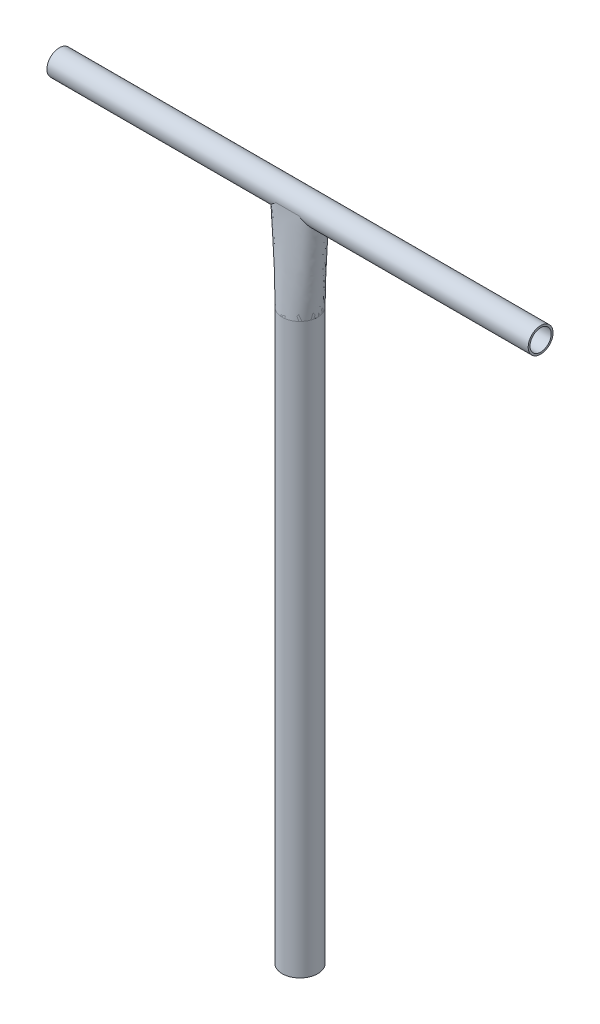
ISO-10303-21;
HEADER;
FILE_DESCRIPTION(('STEP AP214'),'2;1');
FILE_NAME('part.step','',(''),(''),'','','');
FILE_SCHEMA(('AUTOMOTIVE_DESIGN { 1 0 10303 214 1 1 1 1 }'));
ENDSEC;
DATA;
#1=APPLICATION_CONTEXT('core data for automotive mechanical design processes');
#2=APPLICATION_PROTOCOL_DEFINITION('international standard','automotive_design',2000,#1);
#3=PRODUCT_CONTEXT('',#1,'mechanical');
#4=PRODUCT('Part','Part','',(#3));
#5=PRODUCT_RELATED_PRODUCT_CATEGORY('part','',(#4));
#6=PRODUCT_DEFINITION_FORMATION('','',#4);
#7=PRODUCT_DEFINITION_CONTEXT('part definition',#1,'design');
#8=PRODUCT_DEFINITION('design','',#6,#7);
#9=PRODUCT_DEFINITION_SHAPE('','',#8);
#10=(LENGTH_UNIT() NAMED_UNIT(*) SI_UNIT(.MILLI.,.METRE.));
#11=(NAMED_UNIT(*) PLANE_ANGLE_UNIT() SI_UNIT($,.RADIAN.));
#12=(NAMED_UNIT(*) SI_UNIT($,.STERADIAN.) SOLID_ANGLE_UNIT());
#13=UNCERTAINTY_MEASURE_WITH_UNIT(LENGTH_MEASURE(1.E-05),#10,'distance_accuracy_value','');
#14=(GEOMETRIC_REPRESENTATION_CONTEXT(3) GLOBAL_UNCERTAINTY_ASSIGNED_CONTEXT((#13)) GLOBAL_UNIT_ASSIGNED_CONTEXT((#10,
#11,#12)) REPRESENTATION_CONTEXT('',''));
#15=CARTESIAN_POINT('',(0.,0.,0.));
#16=DIRECTION('',(0.,0.,1.));
#17=DIRECTION('',(1.,0.,0.));
#18=AXIS2_PLACEMENT_3D('',#15,#16,#17);
#19=CARTESIAN_POINT('',(215.,590.,0.));
#20=DIRECTION('',(-1.,0.,0.));
#21=DIRECTION('',(0.,0.,1.));
#22=AXIS2_PLACEMENT_3D('',#19,#20,#21);
#23=CYLINDRICAL_SURFACE('',#22,9.46150000000001);
#24=CARTESIAN_POINT('',(215.,590.,0.));
#25=DIRECTION('',(1.,0.,0.));
#26=DIRECTION('',(0.,0.,-1.));
#27=AXIS2_PLACEMENT_3D('',#24,#25,#26);
#28=CIRCLE('',#27,9.46150000000001);
#29=CARTESIAN_POINT('',(215.,590.,-9.46150000000001));
#30=VERTEX_POINT('',#29);
#31=EDGE_CURVE('E229',#30,#30,#28,.T.);
#32=ORIENTED_EDGE('',*,*,#31,.T.);
#33=EDGE_LOOP('',(#32));
#34=FACE_BOUND('',#33,.T.);
#35=CARTESIAN_POINT('',(-215.,590.,0.));
#36=DIRECTION('',(1.,0.,0.));
#37=DIRECTION('',(0.,0.,-1.));
#38=AXIS2_PLACEMENT_3D('',#35,#36,#37);
#39=CIRCLE('',#38,9.46150000000001);
#40=CARTESIAN_POINT('',(-215.,590.,-9.46150000000001));
#41=VERTEX_POINT('',#40);
#42=EDGE_CURVE('E235',#41,#41,#39,.T.);
#43=ORIENTED_EDGE('',*,*,#42,.F.);
#44=EDGE_LOOP('',(#43));
#45=FACE_BOUND('',#44,.T.);
#46=ADVANCED_FACE('F222',(#34,#45),#23,.F.);
#47=CARTESIAN_POINT('',(215.,590.,0.));
#48=DIRECTION('',(-1.,0.,0.));
#49=DIRECTION('',(0.,0.,1.));
#50=AXIS2_PLACEMENT_3D('',#47,#48,#49);
#51=CYLINDRICAL_SURFACE('',#50,11.1125);
#52=CARTESIAN_POINT('',(215.,590.,0.));
#53=DIRECTION('',(1.,0.,0.));
#54=DIRECTION('',(0.,0.,-1.));
#55=AXIS2_PLACEMENT_3D('',#52,#53,#54);
#56=CIRCLE('',#55,11.1125);
#57=CARTESIAN_POINT('',(215.,590.,-11.1125));
#58=VERTEX_POINT('',#57);
#59=EDGE_CURVE('E12',#58,#58,#56,.T.);
#60=ORIENTED_EDGE('',*,*,#59,.F.);
#61=EDGE_LOOP('',(#60));
#62=FACE_BOUND('',#61,.T.);
#63=CARTESIAN_POINT('',(-215.,590.,0.));
#64=DIRECTION('',(1.,0.,0.));
#65=DIRECTION('',(0.,0.,-1.));
#66=AXIS2_PLACEMENT_3D('',#63,#64,#65);
#67=CIRCLE('',#66,11.1125);
#68=CARTESIAN_POINT('',(-215.,590.,-11.1125));
#69=VERTEX_POINT('',#68);
#70=EDGE_CURVE('E225',#69,#69,#67,.T.);
#71=ORIENTED_EDGE('',*,*,#70,.T.);
#72=EDGE_LOOP('',(#71));
#73=FACE_BOUND('',#72,.T.);
#74=ADVANCED_FACE('F242',(#62,#73),#51,.T.);
#75=CARTESIAN_POINT('',(215.,590.,0.));
#76=DIRECTION('',(1.,0.,0.));
#77=DIRECTION('',(0.,0.,-1.));
#78=AXIS2_PLACEMENT_3D('',#75,#76,#77);
#79=PLANE('',#78);
#80=ORIENTED_EDGE('',*,*,#31,.F.);
#81=EDGE_LOOP('',(#80));
#82=FACE_BOUND('',#81,.T.);
#83=ORIENTED_EDGE('',*,*,#59,.T.);
#84=EDGE_LOOP('',(#83));
#85=FACE_BOUND('',#84,.T.);
#86=ADVANCED_FACE('F246',(#82,#85),#79,.T.);
#87=CARTESIAN_POINT('',(-215.,590.,0.));
#88=DIRECTION('',(1.,0.,0.));
#89=DIRECTION('',(0.,0.,-1.));
#90=AXIS2_PLACEMENT_3D('',#87,#88,#89);
#91=PLANE('',#90);
#92=ORIENTED_EDGE('',*,*,#42,.T.);
#93=EDGE_LOOP('',(#92));
#94=FACE_BOUND('',#93,.T.);
#95=ORIENTED_EDGE('',*,*,#70,.F.);
#96=EDGE_LOOP('',(#95));
#97=FACE_BOUND('',#96,.T.);
#98=ADVANCED_FACE('F244',(#94,#97),#91,.F.);
#99=CLOSED_SHELL('',(#46,#74,#86,#98));
#100=MANIFOLD_SOLID_BREP('B2',#99);
#101=CARTESIAN_POINT('',(-11.,590.,0.));
#102=DIRECTION('',(0.,1.,0.));
#103=DIRECTION('',(0.,0.,1.));
#104=AXIS2_PLACEMENT_3D('',#101,#102,#103);
#105=PLANE('',#104);
#106=CARTESIAN_POINT('',(-11.,590.,0.));
#107=DIRECTION('',(0.,1.,0.));
#108=DIRECTION('',(0.,0.,1.));
#109=AXIS2_PLACEMENT_3D('',#106,#107,#108);
#110=CIRCLE('',#109,9.34900000000001);
#111=CARTESIAN_POINT('',(-11.,590.,-9.34900000000001));
#112=VERTEX_POINT('',#111);
#113=CARTESIAN_POINT('',(-10.9999999999997,590.,9.34900000000001));
#114=VERTEX_POINT('',#113);
#115=EDGE_CURVE('E358',#112,#114,#110,.T.);
#116=ORIENTED_EDGE('',*,*,#115,.F.);
#117=DIRECTION('',(-1.,0.,0.));
#118=VECTOR('',#117,1.);
#119=CARTESIAN_POINT('',(11.,590.,-9.34900000000001));
#120=LINE('',#119,#118);
#121=CARTESIAN_POINT('',(11.,590.,-9.34900000000001));
#122=VERTEX_POINT('',#121);
#123=EDGE_CURVE('E353',#122,#112,#120,.T.);
#124=ORIENTED_EDGE('',*,*,#123,.F.);
#125=CARTESIAN_POINT('',(11.,590.,0.));
#126=DIRECTION('',(0.,1.,0.));
#127=DIRECTION('',(0.,0.,1.));
#128=AXIS2_PLACEMENT_3D('',#125,#126,#127);
#129=CIRCLE('',#128,9.34900000000001);
#130=CARTESIAN_POINT('',(11.0000000000155,590.,9.34899999999972));
#131=VERTEX_POINT('',#130);
#132=EDGE_CURVE('E328',#131,#122,#129,.T.);
#133=ORIENTED_EDGE('',*,*,#132,.F.);
#134=DIRECTION('',(1.,0.,0.));
#135=VECTOR('',#134,1.);
#136=CARTESIAN_POINT('',(-11.,590.,9.34900000000001));
#137=LINE('',#136,#135);
#138=EDGE_CURVE('E314',#114,#131,#137,.T.);
#139=ORIENTED_EDGE('',*,*,#138,.F.);
#140=EDGE_LOOP('',(#116,#124,#133,#139));
#141=FACE_BOUND('',#140,.T.);
#142=CARTESIAN_POINT('',(-11.,590.,0.));
#143=DIRECTION('',(0.,1.,0.));
#144=DIRECTION('',(0.,0.,1.));
#145=AXIS2_PLACEMENT_3D('',#142,#143,#144);
#146=CIRCLE('',#145,11.);
#147=CARTESIAN_POINT('',(-11.,590.,-11.));
#148=VERTEX_POINT('',#147);
#149=CARTESIAN_POINT('',(-10.9999999995275,590.,11.));
#150=VERTEX_POINT('',#149);
#151=EDGE_CURVE('E436',#148,#150,#146,.T.);
#152=ORIENTED_EDGE('',*,*,#151,.T.);
#153=DIRECTION('',(1.,0.,0.));
#154=VECTOR('',#153,1.);
#155=CARTESIAN_POINT('',(-11.,590.,11.));
#156=LINE('',#155,#154);
#157=CARTESIAN_POINT('',(11.000000000005,590.,11.));
#158=VERTEX_POINT('',#157);
#159=EDGE_CURVE('E337',#150,#158,#156,.T.);
#160=ORIENTED_EDGE('',*,*,#159,.T.);
#161=CARTESIAN_POINT('',(11.,590.,0.));
#162=DIRECTION('',(0.,1.,0.));
#163=DIRECTION('',(0.,0.,1.));
#164=AXIS2_PLACEMENT_3D('',#161,#162,#163);
#165=CIRCLE('',#164,11.);
#166=CARTESIAN_POINT('',(11.,590.,-11.));
#167=VERTEX_POINT('',#166);
#168=EDGE_CURVE('E320',#158,#167,#165,.T.);
#169=ORIENTED_EDGE('',*,*,#168,.T.);
#170=DIRECTION('',(-1.,0.,0.));
#171=VECTOR('',#170,1.);
#172=CARTESIAN_POINT('',(-11.,590.,-11.));
#173=LINE('',#172,#171);
#174=EDGE_CURVE('E220',#167,#148,#173,.T.);
#175=ORIENTED_EDGE('',*,*,#174,.T.);
#176=EDGE_LOOP('',(#152,#160,#169,#175));
#177=FACE_BOUND('',#176,.T.);
#178=ADVANCED_FACE('F307',(#141,#177),#105,.T.);
#179=CARTESIAN_POINT('',(10.9999999953566,590.,-11.));
#180=CARTESIAN_POINT('',(11.2253201513364,508.,-11.2253201513364));
#181=CARTESIAN_POINT('',(12.3090891308917,590.,-11.));
#182=CARTESIAN_POINT('',(12.0415781968215,508.,-10.4090621058514));
#183=CARTESIAN_POINT('',(15.01344854604,589.999999999999,-10.5274581359016));
#184=CARTESIAN_POINT('',(13.422899628302,508.,-8.67548629951226));
#185=CARTESIAN_POINT('',(18.7217543515113,590.000000000001,-8.2419078953078));
#186=CARTESIAN_POINT('',(14.8515095776182,508.,-5.88135079536727));
#187=CARTESIAN_POINT('',(21.3603432230159,589.999999999999,-4.54544135753386));
#188=CARTESIAN_POINT('',(15.6902979638633,508.000000000001,-2.96872470906742));
#189=CARTESIAN_POINT('',(22.3210076300323,590.000000000001,0.));
#190=CARTESIAN_POINT('',(15.9673441340056,507.999999999999,0.));
#191=CARTESIAN_POINT('',(21.3603432230159,589.999999999999,4.54544135753384));
#192=CARTESIAN_POINT('',(15.6902979638633,508.000000000001,2.9687247090674));
#193=CARTESIAN_POINT('',(18.7217543515113,590.000000000001,8.2419078953078));
#194=CARTESIAN_POINT('',(14.8515095776182,507.999999999999,5.88135079536724));
#195=CARTESIAN_POINT('',(15.01344854604,589.999999999999,10.5274581359016));
#196=CARTESIAN_POINT('',(13.422899628302,508.000000000001,8.67548629951228));
#197=CARTESIAN_POINT('',(12.3090891308917,590.,11.));
#198=CARTESIAN_POINT('',(12.0415781968215,508.,10.4090621058514));
#199=CARTESIAN_POINT('',(9.95252584177617,590.,11.));
#200=CARTESIAN_POINT('',(10.5721872346476,508.,11.8784530680253));
#201=CARTESIAN_POINT('',(7.97372270624526,590.,11.));
#202=CARTESIAN_POINT('',(9.10233305905277,508.,13.1198827748313));
#203=CARTESIAN_POINT('',(5.23076553551383,590.,11.));
#204=CARTESIAN_POINT('',(6.41464182297419,508.000000000001,14.6363244482702));
#205=CARTESIAN_POINT('',(2.58986788716202,590.,11.));
#206=CARTESIAN_POINT('',(3.32430888006194,507.999999999999,15.6399381242038));
#207=CARTESIAN_POINT('',(0.,589.999999999999,11.));
#208=CARTESIAN_POINT('',(0.,508.,15.9927963564254));
#209=CARTESIAN_POINT('',(-2.58986788716201,590.,11.));
#210=CARTESIAN_POINT('',(-3.32430888006197,508.000000000001,15.6399381242038));
#211=CARTESIAN_POINT('',(-5.23076553551383,590.,11.));
#212=CARTESIAN_POINT('',(-6.41464182297414,507.999999999999,14.6363244482701));
#213=CARTESIAN_POINT('',(-7.97372270624526,590.,11.));
#214=CARTESIAN_POINT('',(-9.10233305905282,508.000000000001,13.1198827748313));
#215=CARTESIAN_POINT('',(-9.95252584177617,590.,11.));
#216=CARTESIAN_POINT('',(-10.5721872346476,508.,11.8784530680253));
#217=CARTESIAN_POINT('',(-12.3090891308917,590.,11.));
#218=CARTESIAN_POINT('',(-12.0415781968215,508.,10.4090621058514));
#219=CARTESIAN_POINT('',(-15.01344854604,589.999999999999,10.5274581359016));
#220=CARTESIAN_POINT('',(-13.422899628302,508.,8.67548629951224));
#221=CARTESIAN_POINT('',(-18.7217543515112,590.000000000001,8.24190789530781));
#222=CARTESIAN_POINT('',(-14.8515095776182,508.,5.88135079536727));
#223=CARTESIAN_POINT('',(-21.3603432230158,589.999999999998,4.54544135753385));
#224=CARTESIAN_POINT('',(-15.6902979638633,508.000000000001,2.96872470906739));
#225=CARTESIAN_POINT('',(-22.3210076300323,590.000000000001,0.));
#226=CARTESIAN_POINT('',(-15.9673441340056,507.999999999998,0.));
#227=CARTESIAN_POINT('',(-21.3603432230158,589.999999999999,-4.54544135753384));
#228=CARTESIAN_POINT('',(-15.6902979638633,508.000000000001,-2.96872470906742));
#229=CARTESIAN_POINT('',(-18.7217543515113,590.000000000001,-8.24190789530781));
#230=CARTESIAN_POINT('',(-14.8515095776182,507.999999999999,-5.88135079536726));
#231=CARTESIAN_POINT('',(-15.01344854604,589.999999999999,-10.5274581359016));
#232=CARTESIAN_POINT('',(-13.422899628302,508.000000000001,-8.67548629951228));
#233=CARTESIAN_POINT('',(-12.3090891308917,590.,-11.));
#234=CARTESIAN_POINT('',(-12.0415781968215,508.,-10.4090621058514));
#235=CARTESIAN_POINT('',(-9.95252584177617,590.,-11.));
#236=CARTESIAN_POINT('',(-10.5721872346476,508.,-11.8784530680253));
#237=CARTESIAN_POINT('',(-7.97372270624527,590.,-11.));
#238=CARTESIAN_POINT('',(-9.10233305905279,507.999999999999,-13.1198827748313));
#239=CARTESIAN_POINT('',(-5.23076553551384,590.,-11.));
#240=CARTESIAN_POINT('',(-6.41464182297419,508.000000000001,-14.6363244482701));
#241=CARTESIAN_POINT('',(-2.58986788716202,590.,-11.));
#242=CARTESIAN_POINT('',(-3.32430888006195,507.999999999999,-15.6399381242038));
#243=CARTESIAN_POINT('',(0.,589.999999999999,-11.));
#244=CARTESIAN_POINT('',(0.,508.000000000001,-15.9927963564254));
#245=CARTESIAN_POINT('',(2.58986788716201,590.,-11.));
#246=CARTESIAN_POINT('',(3.32430888006197,508.,-15.6399381242038));
#247=CARTESIAN_POINT('',(5.23076553551383,590.,-11.));
#248=CARTESIAN_POINT('',(6.41464182297413,508.,-14.6363244482701));
#249=CARTESIAN_POINT('',(7.97372270624526,590.,-11.));
#250=CARTESIAN_POINT('',(9.10233305905282,508.,-13.1198827748313));
#251=CARTESIAN_POINT('',(9.95252584177616,590.,-11.));
#252=CARTESIAN_POINT('',(10.5721872346476,508.,-11.8784530680253));
#253=CARTESIAN_POINT('',(10.9999999953566,590.,-11.));
#254=CARTESIAN_POINT('',(11.2253201513364,508.,-11.2253201513364));
#255=B_SPLINE_SURFACE_WITH_KNOTS('',3,1,((#179,#180),(#181,#182),(#183,#184),(#185,#186),(#187,
#188),(#189,#190),(#191,#192),(#193,#194),(#195,#196),(#197,#198),(#199,#200),(#201,#202),(#203,
#204),(#205,#206),(#207,#208),(#209,#210),(#211,#212),(#213,#214),(#215,#216),(#217,#218),(#219,
#220),(#221,#222),(#223,#224),(#225,#226),(#227,#228),(#229,#230),(#231,#232),(#233,#234),(#235,
#236),(#237,#238),(#239,#240),(#241,#242),(#243,#244),(#245,#246),(#247,#248),(#249,#250),(#251,
#252),(#253,#254)),.UNSPECIFIED.,.T.,.F.,.F.,(4,1,1,1,1,1,1,1,2,1,1,1,1,1,1,1,2,1,1,1,1,1,1,1,2,
1,1,1,1,1,1,1,4),(2,2),(0.,0.0347192334484893,0.0694384668969786,0.104157700345468,
0.138876933793957,0.173596167242447,0.208315400690936,0.243034634139425,0.277753867587914,
0.305534634139425,0.333315400690936,0.361096167242447,0.388876933793957,0.416657700345468,
0.444438466896979,0.472219233448489,0.5,0.534719233448489,0.569438466896979,0.604157700345468,
0.638876933793957,0.673596167242447,0.708315400690936,0.743034634139425,0.777753867587914,
0.805534634139425,0.833315400690936,0.861096167242446,0.888876933793957,0.916657700345468,
0.944438466896979,0.972219233448489,1.),(0.,1.),.UNSPECIFIED.);
#256=CARTESIAN_POINT('',(0.,508.,0.));
#257=DIRECTION('',(0.,1.,0.));
#258=DIRECTION('',(0.,0.,1.));
#259=AXIS2_PLACEMENT_3D('',#256,#257,#258);
#260=CIRCLE('',#259,15.875);
#261=CARTESIAN_POINT('',(0.,508.,15.875));
#262=VERTEX_POINT('',#261);
#263=EDGE_CURVE('E363',#262,#262,#260,.T.);
#264=ORIENTED_EDGE('',*,*,#168,.F.);
#265=ORIENTED_EDGE('',*,*,#159,.F.);
#266=ORIENTED_EDGE('',*,*,#151,.F.);
#267=ORIENTED_EDGE('',*,*,#174,.F.);
#268=EDGE_LOOP('',(#264,#265,#266,#267));
#269=FACE_BOUND('',#268,.T.);
#270=ORIENTED_EDGE('',*,*,#263,.T.);
#271=EDGE_LOOP('',(#270));
#272=FACE_BOUND('',#271,.T.);
#273=ADVANCED_FACE('F309',(#269,#272),#255,.T.);
#274=CARTESIAN_POINT('',(-10.9999999957316,590.,-9.34900000000001));
#275=CARTESIAN_POINT('',(-12.0963293035809,508.,-10.2807802417585));
#276=CARTESIAN_POINT('',(-9.95139668587565,590.,-9.34900000000001));
#277=CARTESIAN_POINT('',(-11.4370472299442,508.,-11.056489174265));
#278=CARTESIAN_POINT('',(-7.97147444475548,590.,-9.34900000000001));
#279=CARTESIAN_POINT('',(-9.91861923703592,508.,-12.539937238297));
#280=CARTESIAN_POINT('',(-5.22881715104387,590.,-9.34900000000001));
#281=CARTESIAN_POINT('',(-7.04446967410628,508.,-14.3693716917849));
#282=CARTESIAN_POINT('',(-2.58875883188397,590.,-9.34900000000001));
#283=CARTESIAN_POINT('',(-3.66875038215714,508.,-15.5884475656766));
#284=CARTESIAN_POINT('',(0.,590.,-9.349));
#285=CARTESIAN_POINT('',(-8.45244013669699E-13,508.,-16.0186224404952));
#286=CARTESIAN_POINT('',(2.58875883188414,590.,-9.34900000000001));
#287=CARTESIAN_POINT('',(3.66875038215553,508.,-15.5884475656769));
#288=CARTESIAN_POINT('',(5.22881715104402,590.,-9.34900000000001));
#289=CARTESIAN_POINT('',(7.04446967410487,508.,-14.3693716917857));
#290=CARTESIAN_POINT('',(7.97147444475558,590.,-9.34900000000001));
#291=CARTESIAN_POINT('',(9.91861923703476,507.999999999999,-12.5399372382978));
#292=CARTESIAN_POINT('',(9.95139668587569,590.,-9.34900000000001));
#293=CARTESIAN_POINT('',(11.4370472299433,508.,-11.056489174266));
#294=CARTESIAN_POINT('',(12.0918445820964,590.,-9.34900000000001));
#295=CARTESIAN_POINT('',(12.7827982058063,508.,-9.47308338386143));
#296=CARTESIAN_POINT('',(14.3592032526934,590.000000000001,-8.96259942870784));
#297=CARTESIAN_POINT('',(13.9175093662471,508.,-7.81562150508931));
#298=CARTESIAN_POINT('',(17.5145733629453,589.999999999998,-7.05078249333997));
#299=CARTESIAN_POINT('',(15.0650473292585,508.,-5.25015892594106));
#300=CARTESIAN_POINT('',(19.7919718346422,590.000000000001,-3.90595302662209));
#301=CARTESIAN_POINT('',(15.7294628566522,508.,-2.63645543622529));
#302=CARTESIAN_POINT('',(20.6286751751421,589.999999999999,-2.67884672777718E-12));
#303=CARTESIAN_POINT('',(15.9477737546404,507.999999999999,-1.47234655023532E-12));
#304=CARTESIAN_POINT('',(19.7919718346444,590.000000000001,3.90595302661718));
#305=CARTESIAN_POINT('',(15.7294628566527,508.000000000001,2.63645543622242));
#306=CARTESIAN_POINT('',(17.5145733629492,590.,7.05078249333641));
#307=CARTESIAN_POINT('',(15.0650473292595,507.999999999999,5.25015892593825));
#308=CARTESIAN_POINT('',(14.3592032526983,589.999999999999,8.96259942870602));
#309=CARTESIAN_POINT('',(13.9175093662487,508.000000000001,7.81562150508673));
#310=CARTESIAN_POINT('',(12.0918445821014,590.,9.34899999999942));
#311=CARTESIAN_POINT('',(12.7827982058081,508.,9.47308338385902));
#312=CARTESIAN_POINT('',(9.95139668588048,590.,9.349));
#313=CARTESIAN_POINT('',(11.4370472299453,508.,11.0564891742639));
#314=CARTESIAN_POINT('',(7.97147444475998,590.,9.349));
#315=CARTESIAN_POINT('',(9.91861923703686,508.,12.5399372382962));
#316=CARTESIAN_POINT('',(5.22881715104778,590.,9.349));
#317=CARTESIAN_POINT('',(7.04446967410698,507.999999999999,14.3693716917847));
#318=CARTESIAN_POINT('',(2.58875883188726,590.,9.349));
#319=CARTESIAN_POINT('',(3.66875038215753,508.,15.5884475656764));
#320=CARTESIAN_POINT('',(2.5732454361771E-12,590.,9.34900000000001));
#321=CARTESIAN_POINT('',(9.5062846483529E-13,508.,16.0186224404953));
#322=CARTESIAN_POINT('',(-2.58875883188212,590.,9.34900000000001));
#323=CARTESIAN_POINT('',(-3.66875038215565,507.999999999999,15.5884475656769));
#324=CARTESIAN_POINT('',(-5.22881715104266,590.,9.349));
#325=CARTESIAN_POINT('',(-7.04446967410517,508.000000000001,14.3693716917855));
#326=CARTESIAN_POINT('',(-7.9714744447549,590.,9.349));
#327=CARTESIAN_POINT('',(-9.91861923703522,508.,12.5399372382975));
#328=CARTESIAN_POINT('',(-9.95139668587547,590.,9.34900000000001));
#329=CARTESIAN_POINT('',(-11.4370472299438,508.,11.0564891742655));
#330=CARTESIAN_POINT('',(-12.0918445820966,590.,9.34900000000001));
#331=CARTESIAN_POINT('',(-12.7827982058068,508.,9.47308338386074));
#332=CARTESIAN_POINT('',(-14.359203252694,589.999999999999,8.96259942870769));
#333=CARTESIAN_POINT('',(-13.9175093662477,508.,7.81562150508851));
#334=CARTESIAN_POINT('',(-17.5145733629463,590.000000000001,7.05078249333915));
#335=CARTESIAN_POINT('',(-15.0650473292588,508.,5.25015892594008));
#336=CARTESIAN_POINT('',(-19.7919718346431,589.999999999999,3.90595302662025));
#337=CARTESIAN_POINT('',(-15.7294628566524,508.,2.63645543622422));
#338=CARTESIAN_POINT('',(-20.6286751751422,590.,-1.09721259855533E-13));
#339=CARTESIAN_POINT('',(-15.9477737546404,508.000000000001,3.21357523924704E-13));
#340=CARTESIAN_POINT('',(-19.791971834643,590.,-3.90595302662046));
#341=CARTESIAN_POINT('',(-15.7294628566525,507.999999999999,-2.63645543622362));
#342=CARTESIAN_POINT('',(-17.5145733629462,590.,-7.05078249333924));
#343=CARTESIAN_POINT('',(-15.0650473292591,508.000000000002,-5.2501589259395));
#344=CARTESIAN_POINT('',(-14.3592032526939,590.,-8.96259942870773));
#345=CARTESIAN_POINT('',(-13.9175093662479,507.999999999999,-7.81562150508798));
#346=CARTESIAN_POINT('',(-12.0918445820966,590.,-9.34900000000001));
#347=CARTESIAN_POINT('',(-12.7827982058071,508.,-9.4730833838603));
#348=CARTESIAN_POINT('',(-10.9999999957316,590.,-9.34900000000001));
#349=CARTESIAN_POINT('',(-12.0963293035809,508.,-10.2807802417585));
#350=B_SPLINE_SURFACE_WITH_KNOTS('',3,1,((#274,#275),(#276,#277),(#278,#279),(#280,#281),(#282,
#283),(#284,#285),(#286,#287),(#288,#289),(#290,#291),(#292,#293),(#294,#295),(#296,#297),(#298,
#299),(#300,#301),(#302,#303),(#304,#305),(#306,#307),(#308,#309),(#310,#311),(#312,#313),(#314,
#315),(#316,#317),(#318,#319),(#320,#321),(#322,#323),(#324,#325),(#326,#327),(#328,#329),(#330,
#331),(#332,#333),(#334,#335),(#336,#337),(#338,#339),(#340,#341),(#342,#343),(#344,#345),(#346,
#347),(#348,#349)),.UNSPECIFIED.,.T.,.F.,.F.,(4,1,1,1,1,1,1,1,2,1,1,1,1,1,1,1,2,1,1,1,1,1,1,1,2,
1,1,1,1,1,1,1,4),(2,2),(0.,0.0306186882575862,0.0612373765151725,0.0918560647727588,
0.122474753030345,0.153093441287931,0.183712129545518,0.214330817803104,0.24494950606069,
0.2768308178031,0.308712129545509,0.340593441287919,0.372474753030329,0.404356064772738,
0.436237376515148,0.468118688257558,0.499999999999967,0.530618688257558,0.561237376515149,
0.59185606477274,0.622474753030331,0.653093441287922,0.683712129545512,0.714330817803103,
0.744949506060694,0.776830817803107,0.808712129545521,0.840593441287934,0.872474753030347,
0.90435606477276,0.936237376515173,0.968118688257587,1.),(0.,1.),.UNSPECIFIED.);
#351=ORIENTED_EDGE('',*,*,#132,.T.);
#352=ORIENTED_EDGE('',*,*,#123,.T.);
#353=ORIENTED_EDGE('',*,*,#115,.T.);
#354=ORIENTED_EDGE('',*,*,#138,.T.);
#355=EDGE_LOOP('',(#351,#352,#353,#354));
#356=FACE_BOUND('',#355,.T.);
#357=ORIENTED_EDGE('',*,*,#263,.F.);
#358=EDGE_LOOP('',(#357));
#359=FACE_BOUND('',#358,.T.);
#360=ADVANCED_FACE('F356',(#356,#359),#350,.F.);
#361=CLOSED_SHELL('',(#178,#273,#360));
#362=MANIFOLD_SOLID_BREP('B7',#361);
#363=CARTESIAN_POINT('',(0.,508.,0.));
#364=DIRECTION('',(0.,-1.,0.));
#365=DIRECTION('',(0.,0.,-1.));
#366=AXIS2_PLACEMENT_3D('',#363,#364,#365);
#367=CYLINDRICAL_SURFACE('',#366,14.224);
#368=CARTESIAN_POINT('',(0.,508.,0.));
#369=DIRECTION('',(0.,1.,0.));
#370=DIRECTION('',(0.,0.,1.));
#371=AXIS2_PLACEMENT_3D('',#368,#369,#370);
#372=CIRCLE('',#371,14.224);
#373=CARTESIAN_POINT('',(0.,508.,14.224));
#374=VERTEX_POINT('',#373);
#375=EDGE_CURVE('E618',#374,#374,#372,.T.);
#376=ORIENTED_EDGE('',*,*,#375,.T.);
#377=EDGE_LOOP('',(#376));
#378=FACE_BOUND('',#377,.T.);
#379=CARTESIAN_POINT('',(0.,0.,0.));
#380=DIRECTION('',(0.,1.,0.));
#381=DIRECTION('',(0.,0.,1.));
#382=AXIS2_PLACEMENT_3D('',#379,#380,#381);
#383=CIRCLE('',#382,14.224);
#384=CARTESIAN_POINT('',(0.,0.,14.224));
#385=VERTEX_POINT('',#384);
#386=EDGE_CURVE('E630',#385,#385,#383,.T.);
#387=ORIENTED_EDGE('',*,*,#386,.F.);
#388=EDGE_LOOP('',(#387));
#389=FACE_BOUND('',#388,.T.);
#390=ADVANCED_FACE('F609',(#378,#389),#367,.F.);
#391=CARTESIAN_POINT('',(0.,508.,0.));
#392=DIRECTION('',(0.,-1.,0.));
#393=DIRECTION('',(0.,0.,-1.));
#394=AXIS2_PLACEMENT_3D('',#391,#392,#393);
#395=CYLINDRICAL_SURFACE('',#394,15.875);
#396=CARTESIAN_POINT('',(0.,508.,15.875));
#397=CARTESIAN_POINT('',(0.260033301329907,508.,15.8750217880125));
#398=CARTESIAN_POINT('',(0.520070160748486,508.,15.8686708557079));
#399=CARTESIAN_POINT('',(1.03891303127545,508.,15.8432295593933));
#400=CARTESIAN_POINT('',(1.2977204984685,508.,15.8241688632864));
#401=CARTESIAN_POINT('',(1.81410516081956,508.,15.7733120430005));
#402=CARTESIAN_POINT('',(2.07168224474022,508.,15.7415147885811));
#403=CARTESIAN_POINT('',(2.5856076669347,508.,15.6652267754904));
#404=CARTESIAN_POINT('',(2.84195130282295,508.,15.6207043789559));
#405=CARTESIAN_POINT('',(3.35206529350666,508.,15.5192483870165));
#406=CARTESIAN_POINT('',(3.60583662809901,508.,15.4623197185555));
#407=CARTESIAN_POINT('',(4.10970566465173,508.,15.3361770234891));
#408=CARTESIAN_POINT('',(4.35981031988295,508.,15.2669907901487));
#409=CARTESIAN_POINT('',(4.85635074492558,508.,15.1163658594479));
#410=CARTESIAN_POINT('',(5.10278585564504,508.,15.034924989504));
#411=CARTESIAN_POINT('',(5.59199629718437,508.,14.8598245215811));
#412=CARTESIAN_POINT('',(5.83476045978672,508.,14.7661337367529));
#413=CARTESIAN_POINT('',(6.3153112025555,508.,14.5670941532555));
#414=CARTESIAN_POINT('',(6.55310035138262,508.,14.4617515564992));
#415=CARTESIAN_POINT('',(7.0226786065426,508.,14.2397330757834));
#416=CARTESIAN_POINT('',(7.25447995528177,508.,14.1230830960508));
#417=CARTESIAN_POINT('',(7.71209399161246,508.,13.8784820452169));
#418=CARTESIAN_POINT('',(7.9379056089378,508.,13.7505289718923));
#419=CARTESIAN_POINT('',(8.38355561240395,508.,13.4833528158682));
#420=CARTESIAN_POINT('',(8.60337696062382,508.,13.3441013242512));
#421=CARTESIAN_POINT('',(9.03586335648173,508.,13.0551354238585));
#422=CARTESIAN_POINT('',(9.24853213335504,508.,12.9054265966997));
#423=CARTESIAN_POINT('',(9.66577391783788,508.,12.5960639678375));
#424=CARTESIAN_POINT('',(9.8703639862861,508.,12.4364331842513));
#425=CARTESIAN_POINT('',(10.2714657992595,508.,12.1072560037766));
#426=CARTESIAN_POINT('',(10.467976103469,508.,11.9377078519357));
#427=CARTESIAN_POINT('',(10.8529395848184,508.,11.5887234082949));
#428=CARTESIAN_POINT('',(11.0413705091111,508.,11.4092625773798));
#429=CARTESIAN_POINT('',(11.4091723495683,508.,11.0414751654639));
#430=CARTESIAN_POINT('',(11.5885480122313,508.,10.8531533312934));
#431=CARTESIAN_POINT('',(11.9374189579383,508.,10.4683351845181));
#432=CARTESIAN_POINT('',(12.1069354646135,508.,10.2718581193395));
#433=CARTESIAN_POINT('',(12.4361109365807,508.,9.87075490422825));
#434=CARTESIAN_POINT('',(12.5957681468579,508.,9.66612731405571));
#435=CARTESIAN_POINT('',(12.9052511753722,508.,9.24874585910046));
#436=CARTESIAN_POINT('',(13.0550503810004,508.,9.03597226802973));
#437=CARTESIAN_POINT('',(13.3440332476038,508.,8.60349720861013));
#438=CARTESIAN_POINT('',(13.4832224899357,508.,8.38379946988656));
#439=CARTESIAN_POINT('',(13.7503156820739,508.,7.93831415075755));
#440=CARTESIAN_POINT('',(13.8782442026919,508.,7.71254130741922));
#441=CARTESIAN_POINT('',(14.1228433048693,508.,7.25492622928979));
#442=CARTESIAN_POINT('',(14.2395118841592,508.,7.02308292431896));
#443=CARTESIAN_POINT('',(14.4616212006095,508.,6.55334419329398));
#444=CARTESIAN_POINT('',(14.5670319881069,508.,6.31543461184935));
#445=CARTESIAN_POINT('',(14.7660904313536,508.,5.83489167892559));
#446=CARTESIAN_POINT('',(14.8597442888292,508.,5.59226089653939));
#447=CARTESIAN_POINT('',(15.0347954858117,508.,5.10322815603865));
#448=CARTESIAN_POINT('',(15.1162197990682,508.,4.85683585829505));
#449=CARTESIAN_POINT('',(15.2668427251319,508.,4.36029480796649));
#450=CARTESIAN_POINT('',(15.3360391653611,508.,4.11014539638841));
#451=CARTESIAN_POINT('',(15.462239233277,508.,3.60610118529547));
#452=CARTESIAN_POINT('',(15.5192107251955,508.,3.35219834527139));
#453=CARTESIAN_POINT('',(15.6206950407454,508.,2.84205453426657));
#454=CARTESIAN_POINT('',(15.6652144481438,508.,2.58581487311758));
#455=CARTESIAN_POINT('',(15.7414965306405,508.,2.07202796521202));
#456=CARTESIAN_POINT('',(15.7732875458404,508.,1.81448493088756));
#457=CARTESIAN_POINT('',(15.8241459412121,508.,1.29809970246056));
#458=CARTESIAN_POINT('',(15.8432110619882,508.,1.03925728587622));
#459=CARTESIAN_POINT('',(15.8686520835335,508.,0.520277731074189));
#460=CARTESIAN_POINT('',(15.8749948973887,508.,0.260138976220779));
#461=CARTESIAN_POINT('',(15.8750050999083,508.,-0.260001172303963));
#462=CARTESIAN_POINT('',(15.86867920137,508.,-0.520002565740826));
#463=CARTESIAN_POINT('',(15.8432606917303,508.,-1.0387990983183));
#464=CARTESIAN_POINT('',(15.824196697988,508.,-1.29759563484704));
#465=CARTESIAN_POINT('',(15.7733361030554,508.,-1.8139806466362));
#466=CARTESIAN_POINT('',(15.7415372424788,508.,-2.07156889931725));
#467=CARTESIAN_POINT('',(15.6652415334628,508.,-2.58553970458152));
#468=CARTESIAN_POINT('',(15.620711918475,508.,-2.84191738780055));
#469=CARTESIAN_POINT('',(15.5192476158866,508.,-3.35206517963296));
#470=CARTESIAN_POINT('',(15.4623195121443,508.,-3.60583659761814));
#471=CARTESIAN_POINT('',(15.3361772294379,508.,-4.10970569506472));
#472=CARTESIAN_POINT('',(15.2669908453417,508.,-4.35981032803364));
#473=CARTESIAN_POINT('',(15.1163658042449,508.,-4.85635073677396));
#474=CARTESIAN_POINT('',(15.0349249746949,508.,-5.10278585345841));
#475=CARTESIAN_POINT('',(14.8598245364286,508.,-5.59199629937706));
#476=CARTESIAN_POINT('',(14.76613374073,508.,-5.83476046037408));
#477=CARTESIAN_POINT('',(14.5670941492802,508.,-6.31531120196935));
#478=CARTESIAN_POINT('',(14.4617515554345,508.,-6.5531003512272));
#479=CARTESIAN_POINT('',(14.2397330768438,508.,-7.02267860670218));
#480=CARTESIAN_POINT('',(14.123083096334,508.,-7.25447995532688));
#481=CARTESIAN_POINT('',(13.8784820449311,508.,-7.71209399157355));
#482=CARTESIAN_POINT('',(13.7505289718148,508.,-7.93790560892938));
#483=CARTESIAN_POINT('',(13.483352815944,508.,-8.38355561241695));
#484=CARTESIAN_POINT('',(13.3441013242714,508.,-8.60337696062768));
#485=CARTESIAN_POINT('',(13.0551354238367,508.,-9.0358633564803));
#486=CARTESIAN_POINT('',(12.9054265966917,508.,-9.24853213335738));
#487=CARTESIAN_POINT('',(12.5960639678387,508.,-9.6657739178439));
#488=CARTESIAN_POINT('',(12.4364331842481,508.,-9.87036398629208));
#489=CARTESIAN_POINT('',(12.1072560037705,508.,-10.271465799265));
#490=CARTESIAN_POINT('',(11.9377078519311,508.,-10.4679761034742));
#491=CARTESIAN_POINT('',(11.5887234082928,508.,-10.8529395848216));
#492=CARTESIAN_POINT('',(11.4092625773786,508.,-11.0413705091126));
#493=CARTESIAN_POINT('',(11.0414751654611,508.,-11.4091723495708));
#494=CARTESIAN_POINT('',(10.8531533312879,508.,-11.5885480122363));
#495=CARTESIAN_POINT('',(10.4683351845089,508.,-11.9374189579464));
#496=CARTESIAN_POINT('',(10.2718581193294,508.,-12.1069354646225));
#497=CARTESIAN_POINT('',(9.87075490421817,508.,-12.4361109365897));
#498=CARTESIAN_POINT('',(9.66612731404661,508.,-12.5957681468662));
#499=CARTESIAN_POINT('',(9.24874585909497,508.,-12.9052511753772));
#500=CARTESIAN_POINT('',(9.03597226802694,508.,-13.0550503810028));
#501=CARTESIAN_POINT('',(8.60349720860834,508.,-13.3440332476044));
#502=CARTESIAN_POINT('',(8.38379946988292,508.,-13.4832224899368));
#503=CARTESIAN_POINT('',(7.93831415075146,508.,-13.7503156820757));
#504=CARTESIAN_POINT('',(7.71254130741258,508.,-13.878244202694));
#505=CARTESIAN_POINT('',(7.25492622928317,508.,-14.1228433048714));
#506=CARTESIAN_POINT('',(7.02308292431295,508.,-14.2395118841611));
#507=CARTESIAN_POINT('',(6.55334419329037,508.,-14.4616212006106));
#508=CARTESIAN_POINT('',(6.31543461184754,508.,-14.5670319881074));
#509=CARTESIAN_POINT('',(5.83489167892678,508.,-14.7660904313533));
#510=CARTESIAN_POINT('',(5.59226089654175,508.,-14.8597442888285));
#511=CARTESIAN_POINT('',(5.10322815604257,508.,-15.0347954858106));
#512=CARTESIAN_POINT('',(4.85683585829935,508.,-15.116219799067));
#513=CARTESIAN_POINT('',(4.36029480797079,508.,-15.2668427251307));
#514=CARTESIAN_POINT('',(4.11014539639231,508.,-15.3360391653599));
#515=CARTESIAN_POINT('',(3.60610118529782,508.,-15.4622392332763));
#516=CARTESIAN_POINT('',(3.35219834527257,508.,-15.5192107251952));
#517=CARTESIAN_POINT('',(2.84205453426708,508.,-15.6206950407454));
#518=CARTESIAN_POINT('',(2.5858148731186,508.,-15.6652144481438));
#519=CARTESIAN_POINT('',(2.07202796521373,508.,-15.7414965306406));
#520=CARTESIAN_POINT('',(1.81448493088943,508.,-15.7732875458404));
#521=CARTESIAN_POINT('',(1.29809970246243,508.,-15.8241459412121));
#522=CARTESIAN_POINT('',(1.03925728587792,508.,-15.8432110619882));
#523=CARTESIAN_POINT('',(0.520277731075207,508.,-15.8686520835335));
#524=CARTESIAN_POINT('',(0.26013897622129,508.,-15.8749948973887));
#525=CARTESIAN_POINT('',(-0.260001172302838,508.,-15.8750050999083));
#526=CARTESIAN_POINT('',(-0.520002565738578,508.,-15.86867920137));
#527=CARTESIAN_POINT('',(-1.03879909831456,508.,-15.8432606917303));
#528=CARTESIAN_POINT('',(-1.29759563484292,508.,-15.824196697988));
#529=CARTESIAN_POINT('',(-1.81398064663208,508.,-15.7733361030553));
#530=CARTESIAN_POINT('',(-2.07156889931349,508.,-15.7415372424788));
#531=CARTESIAN_POINT('',(-2.58553970457927,508.,-15.6652415334628));
#532=CARTESIAN_POINT('',(-2.84191738779943,508.,-15.6207119184751));
#533=CARTESIAN_POINT('',(-3.35206517963119,508.,-15.5192476158871));
#534=CARTESIAN_POINT('',(-3.60583659761462,508.,-15.4623195121454));
#535=CARTESIAN_POINT('',(-4.10970569505885,508.,-15.3361772294399));
#536=CARTESIAN_POINT('',(-4.35981032802718,508.,-15.2669908453438));
#537=CARTESIAN_POINT('',(-4.85635073676748,508.,-15.116365804247));
#538=CARTESIAN_POINT('',(-5.10278585345251,508.,-15.0349249746968));
#539=CARTESIAN_POINT('',(-5.59199629937353,508.,-14.8598245364297));
#540=CARTESIAN_POINT('',(-5.83476046037234,508.,-14.7661337407306));
#541=CARTESIAN_POINT('',(-6.31531120196668,508.,-14.5670941492813));
#542=CARTESIAN_POINT('',(-6.55310035122189,508.,-14.461751555437));
#543=CARTESIAN_POINT('',(-7.02267860669338,508.,-14.239733076848));
#544=CARTESIAN_POINT('',(-7.25447995531718,508.,-14.1230830963386));
#545=CARTESIAN_POINT('',(-7.71209399156382,508.,-13.8784820449356));
#546=CARTESIAN_POINT('',(-7.93790560892049,508.,-13.7505289718189));
#547=CARTESIAN_POINT('',(-8.38355561241163,508.,-13.4833528159465));
#548=CARTESIAN_POINT('',(-8.60337696062506,508.,-13.3441013242727));
#549=CARTESIAN_POINT('',(-9.03586335647778,508.,-13.0551354238389));
#550=CARTESIAN_POINT('',(-9.24853213335243,508.,-12.9054265966961));
#551=CARTESIAN_POINT('',(-9.66577391783572,508.,-12.5960639678461));
#552=CARTESIAN_POINT('',(-9.87036398628303,508.,-12.4364331842561));
#553=CARTESIAN_POINT('',(-10.271465799256,508.,-12.1072560037785));
#554=CARTESIAN_POINT('',(-10.4679761034659,508.,-11.9377078519383));
#555=CARTESIAN_POINT('',(-10.8529395848166,508.,-11.5887234082972));
#556=CARTESIAN_POINT('',(-11.0413705091102,508.,-11.4092625773808));
#557=CARTESIAN_POINT('',(-11.4091723495705,508.,-11.0414751654617));
#558=CARTESIAN_POINT('',(-11.5885480122358,508.,-10.853153331289));
#559=CARTESIAN_POINT('',(-11.9374189579456,508.,-10.4683351845109));
#560=CARTESIAN_POINT('',(-12.1069354646216,508.,-10.2718581193315));
#561=CARTESIAN_POINT('',(-12.4361109365888,508.,-9.87075490422027));
#562=CARTESIAN_POINT('',(-12.5957681468654,508.,-9.66612731404852));
#563=CARTESIAN_POINT('',(-12.9052511753767,508.,-9.24874585909612));
#564=CARTESIAN_POINT('',(-13.0550503810026,508.,-9.03597226802751));
#565=CARTESIAN_POINT('',(-13.3440332476048,508.,-8.60349720860762));
#566=CARTESIAN_POINT('',(-13.4832224899375,508.,-8.38379946988149));
#567=CARTESIAN_POINT('',(-13.7503156820768,508.,-7.93831415074908));
#568=CARTESIAN_POINT('',(-13.8782442026953,508.,-7.71254130740997));
#569=CARTESIAN_POINT('',(-14.1228433048727,508.,-7.25492622928057));
#570=CARTESIAN_POINT('',(-14.2395118841623,508.,-7.0230829243106));
#571=CARTESIAN_POINT('',(-14.4616212006113,508.,-6.55334419328894));
#572=CARTESIAN_POINT('',(-14.5670319881077,508.,-6.31543461184682));
#573=CARTESIAN_POINT('',(-14.7660904313544,508.,-5.83489167892402));
#574=CARTESIAN_POINT('',(-14.8597442888308,508.,-5.5922608965362));
#575=CARTESIAN_POINT('',(-15.0347954858142,508.,-5.10322815603329));
#576=CARTESIAN_POINT('',(-15.1162197990711,508.,-4.85683585828916));
#577=CARTESIAN_POINT('',(-15.2668427251348,508.,-4.36029480796061));
#578=CARTESIAN_POINT('',(-15.3360391653637,508.,-4.11014539638307));
#579=CARTESIAN_POINT('',(-15.4622392332786,508.,-3.60610118529226));
#580=CARTESIAN_POINT('',(-15.5192107251963,508.,-3.35219834526977));
#581=CARTESIAN_POINT('',(-15.6206950407454,508.,-2.84205453426435));
#582=CARTESIAN_POINT('',(-15.6652144481438,508.,-2.58581487311314));
#583=CARTESIAN_POINT('',(-15.7414965306404,508.,-2.07202796520463));
#584=CARTESIAN_POINT('',(-15.7732875458403,508.,-1.81448493087944));
#585=CARTESIAN_POINT('',(-15.8241459412121,508.,-1.29809970245245));
#586=CARTESIAN_POINT('',(-15.8432110619882,508.,-1.03925728586885));
#587=CARTESIAN_POINT('',(-15.8686520835335,508.,-0.520277731069769));
#588=CARTESIAN_POINT('',(-15.8749948973887,508.,-0.260138976218571));
#589=CARTESIAN_POINT('',(-15.8750050999083,508.,0.260001172303225));
#590=CARTESIAN_POINT('',(-15.86867920137,508.,0.520002565739355));
#591=CARTESIAN_POINT('',(-15.8432606917303,508.,1.03879909831585));
#592=CARTESIAN_POINT('',(-15.824196697988,508.,1.29759563484435));
#593=CARTESIAN_POINT('',(-15.7733361030554,508.,1.81398064663351));
#594=CARTESIAN_POINT('',(-15.7415372424788,508.,2.07156889931479));
#595=CARTESIAN_POINT('',(-15.6652415334628,508.,2.58553970458004));
#596=CARTESIAN_POINT('',(-15.620711918475,508.,2.84191738779981));
#597=CARTESIAN_POINT('',(-15.5192476158867,508.,3.35206517963301));
#598=CARTESIAN_POINT('',(-15.4623195121446,508.,3.60583659761825));
#599=CARTESIAN_POINT('',(-15.3361772294385,508.,4.1097056950649));
#600=CARTESIAN_POINT('',(-15.2669908453422,508.,4.35981032803384));
#601=CARTESIAN_POINT('',(-15.1163658042455,508.,4.85635073677416));
#602=CARTESIAN_POINT('',(-15.0349249746954,508.,5.1027858534586));
#603=CARTESIAN_POINT('',(-14.8598245364289,508.,5.59199629937718));
#604=CARTESIAN_POINT('',(-14.7661337407301,508.,5.83476046037415));
#605=CARTESIAN_POINT('',(-14.5670941492799,508.,6.3153112019695));
#606=CARTESIAN_POINT('',(-14.461751555434,508.,6.55310035122748));
#607=CARTESIAN_POINT('',(-14.2397330768431,508.,7.02267860670265));
#608=CARTESIAN_POINT('',(-14.1230830963332,508.,7.2544799553274));
#609=CARTESIAN_POINT('',(-13.8784820449302,508.,7.71209399157406));
#610=CARTESIAN_POINT('',(-13.750528971814,508.,7.93790560892984));
#611=CARTESIAN_POINT('',(-13.4833528159436,508.,8.38355561241722));
#612=CARTESIAN_POINT('',(-13.3441013242711,508.,8.60337696062783));
#613=CARTESIAN_POINT('',(-13.0551354238377,508.,9.035863356479));
#614=CARTESIAN_POINT('',(-12.9054265966937,508.,9.24853213335479));
#615=CARTESIAN_POINT('',(-12.596063967842,508.,9.66577391783961));
#616=CARTESIAN_POINT('',(-12.4364331842517,508.,9.87036398628734));
#617=CARTESIAN_POINT('',(-12.1072560037741,508.,10.2714657992603));
#618=CARTESIAN_POINT('',(-11.9377078519344,508.,10.4679761034699));
#619=CARTESIAN_POINT('',(-11.5887234082947,508.,10.8529395848189));
#620=CARTESIAN_POINT('',(-11.4092625773796,508.,11.0413705091113));
#621=CARTESIAN_POINT('',(-11.0414751654617,508.,11.4091723495706));
#622=CARTESIAN_POINT('',(-10.8531533312891,508.,11.588548012236));
#623=CARTESIAN_POINT('',(-10.4683351845108,508.,11.9374189579454));
#624=CARTESIAN_POINT('',(-10.2718581193312,508.,12.1069354646206));
#625=CARTESIAN_POINT('',(-9.87075490422052,508.,12.4361109365899));
#626=CARTESIAN_POINT('',(-9.66612731404947,508.,12.5957681468693));
#627=CARTESIAN_POINT('',(-9.24874585909514,508.,12.9052511753728));
#628=CARTESIAN_POINT('',(-9.03597226802389,508.,13.0550503809881));
#629=CARTESIAN_POINT('',(-8.60349720861123,508.,13.3440332476193));
#630=CARTESIAN_POINT('',(-8.38379946989498,508.,13.4832224899916));
#631=CARTESIAN_POINT('',(-7.93831415073563,508.,13.7503156820229));
#632=CARTESIAN_POINT('',(-7.71254130735982,508.,13.8782442024941));
#633=CARTESIAN_POINT('',(-7.25492622933073,508.,14.1228433050738));
#634=CARTESIAN_POINT('',(-7.02308292449779,508.,14.239511884913));
#635=CARTESIAN_POINT('',(-6.55334419310126,508.,14.4616211998586));
#636=CARTESIAN_POINT('',(-6.31543461114554,508.,14.5670319852954));
#637=CARTESIAN_POINT('',(-5.83489167962636,508.,14.7660904341647));
#638=CARTESIAN_POINT('',(-5.5922608991545,508.,14.8597442993182));
#639=CARTESIAN_POINT('',(-5.10322815342847,508.,15.0347954753471));
#640=CARTESIAN_POINT('',(-4.85683584856551,508.,15.1162197600535));
#641=CARTESIAN_POINT('',(-4.36029481769646,508.,15.2668427641548));
#642=CARTESIAN_POINT('',(-4.11014543270324,508.,15.3360393109957));
#643=CARTESIAN_POINT('',(-3.60610114888539,508.,15.4622390872651));
#644=CARTESIAN_POINT('',(-3.35219820922437,508.,15.5192101796133));
#645=CARTESIAN_POINT('',(-2.84202062951704,508.,15.6207023579303));
#646=CARTESIAN_POINT('',(-2.5857469692823,508.,15.6652283690352));
#647=CARTESIAN_POINT('',(-2.07191449983346,508.,15.7415198464967));
#648=CARTESIAN_POINT('',(-1.81436007101238,508.,15.7733147764154));
#649=CARTESIAN_POINT('',(-1.29797509955002,508.,15.8241706428696));
#650=CARTESIAN_POINT('',(-1.03914444570863,508.,15.8432304492857));
#651=CARTESIAN_POINT('',(-0.520208978585058,508.,15.868672229528));
#652=CARTESIAN_POINT('',(-0.260102597818912,508.,15.8750222633246));
#653=CARTESIAN_POINT('',(0.,508.,15.875));
#654=B_SPLINE_CURVE_WITH_KNOTS('',3,(#396,#397,#398,#399,#400,#401,#402,#403,#404,#405,#406,
#407,#408,#409,#410,#411,#412,#413,#414,#415,#416,#417,#418,#419,#420,#421,#422,#423,#424,#425,
#426,#427,#428,#429,#430,#431,#432,#433,#434,#435,#436,#437,#438,#439,#440,#441,#442,#443,#444,
#445,#446,#447,#448,#449,#450,#451,#452,#453,#454,#455,#456,#457,#458,#459,#460,#461,#462,#463,
#464,#465,#466,#467,#468,#469,#470,#471,#472,#473,#474,#475,#476,#477,#478,#479,#480,#481,#482,
#483,#484,#485,#486,#487,#488,#489,#490,#491,#492,#493,#494,#495,#496,#497,#498,#499,#500,#501,
#502,#503,#504,#505,#506,#507,#508,#509,#510,#511,#512,#513,#514,#515,#516,#517,#518,#519,#520,
#521,#522,#523,#524,#525,#526,#527,#528,#529,#530,#531,#532,#533,#534,#535,#536,#537,#538,#539,
#540,#541,#542,#543,#544,#545,#546,#547,#548,#549,#550,#551,#552,#553,#554,#555,#556,#557,#558,
#559,#560,#561,#562,#563,#564,#565,#566,#567,#568,#569,#570,#571,#572,#573,#574,#575,#576,#577,
#578,#579,#580,#581,#582,#583,#584,#585,#586,#587,#588,#589,#590,#591,#592,#593,#594,#595,#596,
#597,#598,#599,#600,#601,#602,#603,#604,#605,#606,#607,#608,#609,#610,#611,#612,#613,#614,#615,
#616,#617,#618,#619,#620,#621,#622,#623,#624,#625,#626,#627,#628,#629,#630,#631,#632,#633,#634,
#635,#636,#637,#638,#639,#640,#641,#642,#643,#644,#645,#646,#647,#648,#649,#650,#651,#652,#653),
.UNSPECIFIED.,.F.,.F.,(4,2,2,2,2,2,2,2,2,2,2,2,2,2,2,2,2,2,2,2,2,2,2,2,2,2,2,2,2,2,2,2,2,2,2,2,
2,2,2,2,2,2,2,2,2,2,2,2,2,2,2,2,2,2,2,2,2,2,2,2,2,2,2,2,2,2,2,2,2,2,2,2,2,2,2,2,2,2,2,2,2,2,2,2,
2,2,2,2,2,2,2,2,2,2,2,2,2,2,2,2,2,2,2,2,2,2,2,2,2,2,2,2,2,2,2,2,2,2,2,2,2,2,2,2,2,2,2,2,4),(0.,
0.780026684443556,1.5582389275756,2.33652024446557,3.1167536499425,3.89667776158145,
4.67485556356482,5.45317148898701,6.23350897028224,7.01343308192442,7.79161088390887,
8.56992680932999,9.35026429062203,10.1301884022645,10.9083662042491,11.6866821296701,
12.4670196109617,13.2469437225965,14.0251215245785,14.8034374500021,15.5837749313014,
16.3636990429363,17.1418768449184,17.9201927703419,18.7005302516412,19.4804543632775,
20.25863216526,21.0369480906831,21.8172855719809,22.597209683614,23.3753874855954,
24.1537034110196,24.9340408923206,25.7139650039571,26.4921428059396,27.2704587313626,
28.0507962126604,28.8307203242996,29.608898126283,30.3872140517052,31.1675515330002,
31.9474756446451,32.7256534466304,33.5039693720507,34.28430685334,35.0642309649886,
35.8424087669751,36.6207246923941,37.4010621736797,38.1809862853256,38.9591640873113,
39.7374800127312,40.5178174940194,41.2977416056599,42.0759194076438,42.8542353330655,
43.6345728143591,44.4144969259918,45.192674727973,45.9709906533973,46.7513281346988,
47.5312522463304,48.3094300483113,49.087745973736,49.8680834550386,50.6480075666716,
51.426185368653,52.2045012940772,52.9848387753783,53.7647628870119,54.5429406889935,
55.3212566144175,56.1015940957181,56.8815182073542,57.6596960093366,58.4380119347598,
59.2183494160578,59.9982735276966,60.7764513296799,61.5547672551021,62.3351047363976,
63.1150288480417,63.8932066500268,64.6715225754473,65.4518600567374,66.2317841683802,
67.0099619703649,67.7882778957858,68.568615377077,69.3485394887187,70.1267172907029,
70.9050332161242,71.6853706974168,72.4652948090565,73.2434726110401,74.0217885364621,
74.8021260177565,75.5820501293907,76.3602279313725,77.1385438567963,77.9188813380963,
78.6988054497355,79.4769832517189,80.2552991771411,81.0356366584361,81.8155607700816,
82.5937385720672,83.3720544974872,84.1523919787758,84.9323160904195,85.7104938924045,
86.4888098178251,87.2691472991155,88.0490714107597,88.8272492127447,89.6055651381652,
90.3859026194553,91.1658267310981,91.9440045330828,92.7223204585037,93.5026579397949,
94.2825820514319,95.0607598534147,95.8390757788375,96.6194132601347,97.3994414844942,
98.1776539071464,98.9559353794848,99.7361702524826),.UNSPECIFIED.);
#655=CARTESIAN_POINT('',(0.,508.,15.875));
#656=VERTEX_POINT('',#655);
#657=EDGE_CURVE('E306',#656,#656,#654,.T.);
#658=ORIENTED_EDGE('',*,*,#657,.F.);
#659=EDGE_LOOP('',(#658));
#660=FACE_BOUND('',#659,.T.);
#661=CARTESIAN_POINT('',(0.,0.,0.));
#662=DIRECTION('',(0.,1.,0.));
#663=DIRECTION('',(0.,0.,1.));
#664=AXIS2_PLACEMENT_3D('',#661,#662,#663);
#665=CIRCLE('',#664,15.875);
#666=CARTESIAN_POINT('',(0.,0.,15.875));
#667=VERTEX_POINT('',#666);
#668=EDGE_CURVE('E624',#667,#667,#665,.T.);
#669=ORIENTED_EDGE('',*,*,#668,.T.);
#670=EDGE_LOOP('',(#669));
#671=FACE_BOUND('',#670,.T.);
#672=ADVANCED_FACE('F649',(#660,#671),#395,.T.);
#673=CARTESIAN_POINT('',(0.,508.,0.));
#674=DIRECTION('',(0.,1.,0.));
#675=DIRECTION('',(0.,0.,1.));
#676=AXIS2_PLACEMENT_3D('',#673,#674,#675);
#677=PLANE('',#676);
#678=ORIENTED_EDGE('',*,*,#375,.F.);
#679=EDGE_LOOP('',(#678));
#680=FACE_BOUND('',#679,.T.);
#681=ORIENTED_EDGE('',*,*,#657,.T.);
#682=EDGE_LOOP('',(#681));
#683=FACE_BOUND('',#682,.T.);
#684=ADVANCED_FACE('F639',(#680,#683),#677,.T.);
#685=CARTESIAN_POINT('',(0.,0.,0.));
#686=DIRECTION('',(0.,1.,0.));
#687=DIRECTION('',(0.,0.,1.));
#688=AXIS2_PLACEMENT_3D('',#685,#686,#687);
#689=PLANE('',#688);
#690=ORIENTED_EDGE('',*,*,#386,.T.);
#691=EDGE_LOOP('',(#690));
#692=FACE_BOUND('',#691,.T.);
#693=ORIENTED_EDGE('',*,*,#668,.F.);
#694=EDGE_LOOP('',(#693));
#695=FACE_BOUND('',#694,.T.);
#696=ADVANCED_FACE('F648',(#692,#695),#689,.F.);
#697=CLOSED_SHELL('',(#390,#672,#684,#696));
#698=MANIFOLD_SOLID_BREP('B214',#697);
#699=ADVANCED_BREP_SHAPE_REPRESENTATION('',(#18,#100,#362,#698),#14);
#700=SHAPE_DEFINITION_REPRESENTATION(#9,#699);
ENDSEC;
END-ISO-10303-21;
